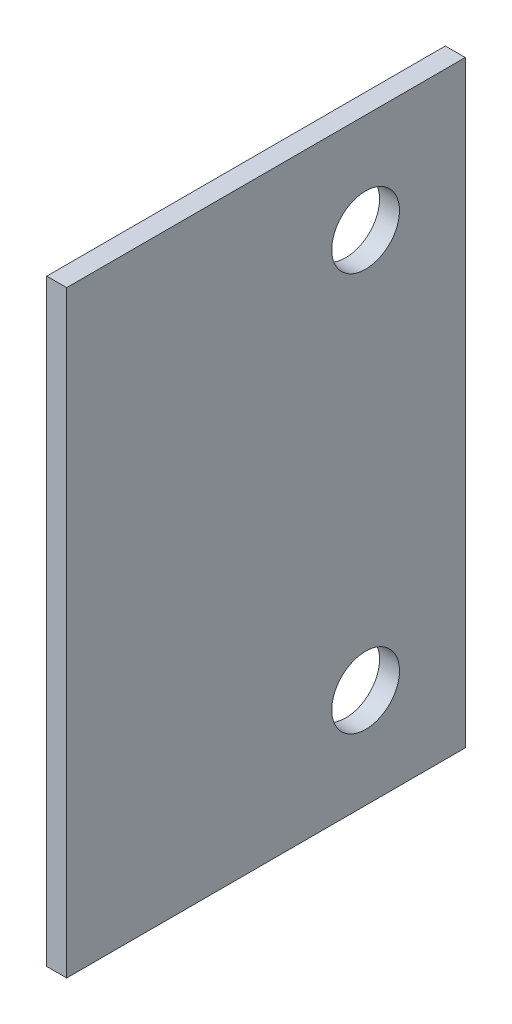
ISO-10303-21;
HEADER;
FILE_DESCRIPTION(('STEP AP214'),'2;1');
FILE_NAME('part.step','',(''),(''),'','','');
FILE_SCHEMA(('AUTOMOTIVE_DESIGN { 1 0 10303 214 1 1 1 1 }'));
ENDSEC;
DATA;
#1=APPLICATION_CONTEXT('core data for automotive mechanical design processes');
#2=APPLICATION_PROTOCOL_DEFINITION('international standard','automotive_design',2000,#1);
#3=PRODUCT_CONTEXT('',#1,'mechanical');
#4=PRODUCT('Part','Part','',(#3));
#5=PRODUCT_RELATED_PRODUCT_CATEGORY('part','',(#4));
#6=PRODUCT_DEFINITION_FORMATION('','',#4);
#7=PRODUCT_DEFINITION_CONTEXT('part definition',#1,'design');
#8=PRODUCT_DEFINITION('design','',#6,#7);
#9=PRODUCT_DEFINITION_SHAPE('','',#8);
#10=(LENGTH_UNIT() NAMED_UNIT(*) SI_UNIT(.MILLI.,.METRE.));
#11=(NAMED_UNIT(*) PLANE_ANGLE_UNIT() SI_UNIT($,.RADIAN.));
#12=(NAMED_UNIT(*) SI_UNIT($,.STERADIAN.) SOLID_ANGLE_UNIT());
#13=UNCERTAINTY_MEASURE_WITH_UNIT(LENGTH_MEASURE(1.E-05),#10,'distance_accuracy_value','');
#14=(GEOMETRIC_REPRESENTATION_CONTEXT(3) GLOBAL_UNCERTAINTY_ASSIGNED_CONTEXT((#13)) GLOBAL_UNIT_ASSIGNED_CONTEXT((#10,
#11,#12)) REPRESENTATION_CONTEXT('',''));
#15=CARTESIAN_POINT('',(0.,0.,0.));
#16=DIRECTION('',(0.,0.,1.));
#17=DIRECTION('',(1.,0.,0.));
#18=AXIS2_PLACEMENT_3D('',#15,#16,#17);
#19=CARTESIAN_POINT('',(0.001200000000154,0.,0.));
#20=DIRECTION('',(1.,0.,0.));
#21=DIRECTION('',(0.,0.,-1.));
#22=AXIS2_PLACEMENT_3D('',#19,#20,#21);
#23=PLANE('',#22);
#24=CARTESIAN_POINT('',(0.00120000000004,25.,5.));
#25=DIRECTION('',(1.,0.,0.));
#26=DIRECTION('',(0.,0.,-1.));
#27=AXIS2_PLACEMENT_3D('',#24,#25,#26);
#28=CIRCLE('',#27,1.7);
#29=CARTESIAN_POINT('',(0.00120000000004,25.,3.3));
#30=VERTEX_POINT('',#29);
#31=EDGE_CURVE('E83',#30,#30,#28,.T.);
#32=ORIENTED_EDGE('',*,*,#31,.T.);
#33=EDGE_LOOP('',(#32));
#34=FACE_BOUND('',#33,.T.);
#35=CARTESIAN_POINT('',(0.00120000000004,5.,5.));
#36=DIRECTION('',(1.,0.,0.));
#37=DIRECTION('',(0.,0.,-1.));
#38=AXIS2_PLACEMENT_3D('',#35,#36,#37);
#39=CIRCLE('',#38,1.7);
#40=CARTESIAN_POINT('',(0.00120000000004,5.,3.3));
#41=VERTEX_POINT('',#40);
#42=EDGE_CURVE('E19',#41,#41,#39,.T.);
#43=ORIENTED_EDGE('',*,*,#42,.T.);
#44=EDGE_LOOP('',(#43));
#45=FACE_BOUND('',#44,.T.);
#46=DIRECTION('',(0.,0.,1.));
#47=VECTOR('',#46,1.);
#48=CARTESIAN_POINT('',(0.00120000000004,30.,0.));
#49=LINE('',#48,#47);
#50=CARTESIAN_POINT('',(0.0012000000000685,30.,0.));
#51=VERTEX_POINT('',#50);
#52=CARTESIAN_POINT('',(0.001200000000097,30.,20.));
#53=VERTEX_POINT('',#52);
#54=EDGE_CURVE('E61',#51,#53,#49,.T.);
#55=ORIENTED_EDGE('',*,*,#54,.F.);
#56=DIRECTION('',(0.,1.,0.));
#57=VECTOR('',#56,1.);
#58=CARTESIAN_POINT('',(0.00120000000004,0.,0.));
#59=LINE('',#58,#57);
#60=CARTESIAN_POINT('',(0.001200000000097,0.,0.));
#61=VERTEX_POINT('',#60);
#62=EDGE_CURVE('E55',#51,#61,#59,.F.);
#63=ORIENTED_EDGE('',*,*,#62,.T.);
#64=DIRECTION('',(0.,0.,1.));
#65=VECTOR('',#64,1.);
#66=CARTESIAN_POINT('',(0.00120000000004,0.,0.));
#67=LINE('',#66,#65);
#68=CARTESIAN_POINT('',(0.001200000000097,0.,20.));
#69=VERTEX_POINT('',#68);
#70=EDGE_CURVE('E59',#61,#69,#67,.T.);
#71=ORIENTED_EDGE('',*,*,#70,.T.);
#72=DIRECTION('',(0.,1.,0.));
#73=VECTOR('',#72,1.);
#74=CARTESIAN_POINT('',(0.00120000000004,0.,20.));
#75=LINE('',#74,#73);
#76=EDGE_CURVE('E94',#53,#69,#75,.F.);
#77=ORIENTED_EDGE('',*,*,#76,.F.);
#78=EDGE_LOOP('',(#55,#63,#71,#77));
#79=FACE_BOUND('',#78,.T.);
#80=ADVANCED_FACE('F16',(#34,#45,#79),#23,.F.);
#81=CARTESIAN_POINT('',(0.001200000000154,0.,0.));
#82=DIRECTION('',(0.,1.,0.));
#83=DIRECTION('',(0.,0.,1.));
#84=AXIS2_PLACEMENT_3D('',#81,#82,#83);
#85=PLANE('',#84);
#86=DIRECTION('',(1.,0.,0.));
#87=VECTOR('',#86,1.);
#88=CARTESIAN_POINT('',(0.001200000000154,0.,20.));
#89=LINE('',#88,#87);
#90=CARTESIAN_POINT('',(1.0012,0.,20.));
#91=VERTEX_POINT('',#90);
#92=EDGE_CURVE('E69',#69,#91,#89,.T.);
#93=ORIENTED_EDGE('',*,*,#92,.F.);
#94=ORIENTED_EDGE('',*,*,#70,.F.);
#95=DIRECTION('',(1.,0.,0.));
#96=VECTOR('',#95,1.);
#97=CARTESIAN_POINT('',(0.001200000000154,0.,0.));
#98=LINE('',#97,#96);
#99=CARTESIAN_POINT('',(1.0012,0.,0.));
#100=VERTEX_POINT('',#99);
#101=EDGE_CURVE('E63',#61,#100,#98,.T.);
#102=ORIENTED_EDGE('',*,*,#101,.T.);
#103=DIRECTION('',(0.,0.,-1.));
#104=VECTOR('',#103,1.);
#105=CARTESIAN_POINT('',(1.0012,0.,0.));
#106=LINE('',#105,#104);
#107=EDGE_CURVE('E85',#91,#100,#106,.T.);
#108=ORIENTED_EDGE('',*,*,#107,.F.);
#109=EDGE_LOOP('',(#93,#94,#102,#108));
#110=FACE_BOUND('',#109,.T.);
#111=ADVANCED_FACE('F66',(#110),#85,.F.);
#112=CARTESIAN_POINT('',(0.001200000000154,0.,0.));
#113=DIRECTION('',(0.,0.,1.));
#114=DIRECTION('',(1.,0.,0.));
#115=AXIS2_PLACEMENT_3D('',#112,#113,#114);
#116=PLANE('',#115);
#117=DIRECTION('',(0.,1.,0.));
#118=VECTOR('',#117,1.);
#119=CARTESIAN_POINT('',(1.0012,0.,0.));
#120=LINE('',#119,#118);
#121=CARTESIAN_POINT('',(1.0012,30.,0.));
#122=VERTEX_POINT('',#121);
#123=EDGE_CURVE('E74',#100,#122,#120,.T.);
#124=ORIENTED_EDGE('',*,*,#123,.F.);
#125=ORIENTED_EDGE('',*,*,#101,.F.);
#126=ORIENTED_EDGE('',*,*,#62,.F.);
#127=DIRECTION('',(1.,0.,0.));
#128=VECTOR('',#127,1.);
#129=CARTESIAN_POINT('',(0.001200000000154,30.,0.));
#130=LINE('',#129,#128);
#131=EDGE_CURVE('E76',#122,#51,#130,.F.);
#132=ORIENTED_EDGE('',*,*,#131,.F.);
#133=EDGE_LOOP('',(#124,#125,#126,#132));
#134=FACE_BOUND('',#133,.T.);
#135=ADVANCED_FACE('F72',(#134),#116,.F.);
#136=CARTESIAN_POINT('',(0.001200000000154,30.,0.));
#137=DIRECTION('',(0.,1.,0.));
#138=DIRECTION('',(0.,0.,1.));
#139=AXIS2_PLACEMENT_3D('',#136,#137,#138);
#140=PLANE('',#139);
#141=DIRECTION('',(1.,0.,0.));
#142=VECTOR('',#141,1.);
#143=CARTESIAN_POINT('',(0.001200000000154,30.,20.));
#144=LINE('',#143,#142);
#145=CARTESIAN_POINT('',(1.0012,30.,20.));
#146=VERTEX_POINT('',#145);
#147=EDGE_CURVE('E34',#146,#53,#144,.F.);
#148=ORIENTED_EDGE('',*,*,#147,.F.);
#149=DIRECTION('',(0.,0.,-1.));
#150=VECTOR('',#149,1.);
#151=CARTESIAN_POINT('',(1.0012,30.,0.));
#152=LINE('',#151,#150);
#153=EDGE_CURVE('E100',#122,#146,#152,.F.);
#154=ORIENTED_EDGE('',*,*,#153,.F.);
#155=ORIENTED_EDGE('',*,*,#131,.T.);
#156=ORIENTED_EDGE('',*,*,#54,.T.);
#157=EDGE_LOOP('',(#148,#154,#155,#156));
#158=FACE_BOUND('',#157,.T.);
#159=ADVANCED_FACE('F98',(#158),#140,.T.);
#160=CARTESIAN_POINT('',(0.001200000000154,0.,20.));
#161=DIRECTION('',(0.,0.,1.));
#162=DIRECTION('',(1.,0.,0.));
#163=AXIS2_PLACEMENT_3D('',#160,#161,#162);
#164=PLANE('',#163);
#165=DIRECTION('',(0.,1.,0.));
#166=VECTOR('',#165,1.);
#167=CARTESIAN_POINT('',(1.0012,0.,20.));
#168=LINE('',#167,#166);
#169=EDGE_CURVE('E82',#146,#91,#168,.F.);
#170=ORIENTED_EDGE('',*,*,#169,.F.);
#171=ORIENTED_EDGE('',*,*,#147,.T.);
#172=ORIENTED_EDGE('',*,*,#76,.T.);
#173=ORIENTED_EDGE('',*,*,#92,.T.);
#174=EDGE_LOOP('',(#170,#171,#172,#173));
#175=FACE_BOUND('',#174,.T.);
#176=ADVANCED_FACE('F106',(#175),#164,.T.);
#177=CARTESIAN_POINT('',(0.001200000000154,5.,5.));
#178=DIRECTION('',(1.,0.,0.));
#179=DIRECTION('',(0.,0.,-1.));
#180=AXIS2_PLACEMENT_3D('',#177,#178,#179);
#181=CYLINDRICAL_SURFACE('',#180,1.7);
#182=ORIENTED_EDGE('',*,*,#42,.F.);
#183=EDGE_LOOP('',(#182));
#184=FACE_BOUND('',#183,.T.);
#185=CARTESIAN_POINT('',(1.0012,5.,5.));
#186=DIRECTION('',(1.,0.,0.));
#187=DIRECTION('',(0.,0.,-1.));
#188=AXIS2_PLACEMENT_3D('',#185,#186,#187);
#189=CIRCLE('',#188,1.7);
#190=CARTESIAN_POINT('',(1.0012,5.,3.3));
#191=VERTEX_POINT('',#190);
#192=EDGE_CURVE('E25',#191,#191,#189,.F.);
#193=ORIENTED_EDGE('',*,*,#192,.F.);
#194=EDGE_LOOP('',(#193));
#195=FACE_BOUND('',#194,.T.);
#196=ADVANCED_FACE('F108',(#184,#195),#181,.F.);
#197=CARTESIAN_POINT('',(0.001200000000154,25.,5.));
#198=DIRECTION('',(1.,0.,0.));
#199=DIRECTION('',(0.,0.,-1.));
#200=AXIS2_PLACEMENT_3D('',#197,#198,#199);
#201=CYLINDRICAL_SURFACE('',#200,1.7);
#202=ORIENTED_EDGE('',*,*,#31,.F.);
#203=EDGE_LOOP('',(#202));
#204=FACE_BOUND('',#203,.T.);
#205=CARTESIAN_POINT('',(1.0012,25.,5.));
#206=DIRECTION('',(1.,0.,0.));
#207=DIRECTION('',(0.,0.,-1.));
#208=AXIS2_PLACEMENT_3D('',#205,#206,#207);
#209=CIRCLE('',#208,1.7);
#210=CARTESIAN_POINT('',(1.0012,25.,3.3));
#211=VERTEX_POINT('',#210);
#212=EDGE_CURVE('E11',#211,#211,#209,.F.);
#213=ORIENTED_EDGE('',*,*,#212,.F.);
#214=EDGE_LOOP('',(#213));
#215=FACE_BOUND('',#214,.T.);
#216=ADVANCED_FACE('F115',(#204,#215),#201,.F.);
#217=CARTESIAN_POINT('',(1.0012,0.,0.));
#218=DIRECTION('',(1.,0.,0.));
#219=DIRECTION('',(0.,0.,-1.));
#220=AXIS2_PLACEMENT_3D('',#217,#218,#219);
#221=PLANE('',#220);
#222=ORIENTED_EDGE('',*,*,#212,.T.);
#223=EDGE_LOOP('',(#222));
#224=FACE_BOUND('',#223,.T.);
#225=ORIENTED_EDGE('',*,*,#192,.T.);
#226=EDGE_LOOP('',(#225));
#227=FACE_BOUND('',#226,.T.);
#228=ORIENTED_EDGE('',*,*,#153,.T.);
#229=ORIENTED_EDGE('',*,*,#169,.T.);
#230=ORIENTED_EDGE('',*,*,#107,.T.);
#231=ORIENTED_EDGE('',*,*,#123,.T.);
#232=EDGE_LOOP('',(#228,#229,#230,#231));
#233=FACE_BOUND('',#232,.T.);
#234=ADVANCED_FACE('F104',(#224,#227,#233),#221,.T.);
#235=CLOSED_SHELL('',(#80,#111,#135,#159,#176,#196,#216,#234));
#236=MANIFOLD_SOLID_BREP('B1',#235);
#237=ADVANCED_BREP_SHAPE_REPRESENTATION('',(#18,#236),#14);
#238=SHAPE_DEFINITION_REPRESENTATION(#9,#237);
ENDSEC;
END-ISO-10303-21;
